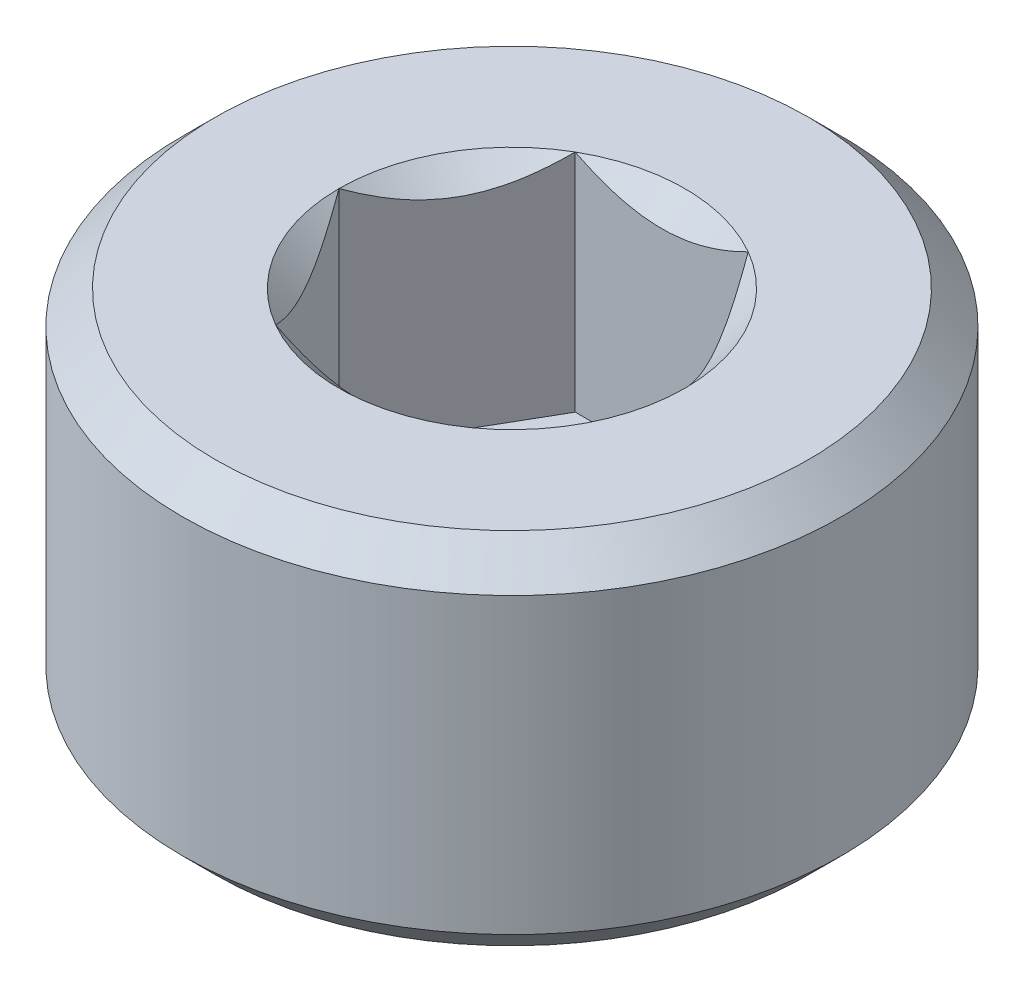
ISO-10303-21;
HEADER;
FILE_DESCRIPTION(('STEP AP214'),'2;1');
FILE_NAME('part.step','',(''),(''),'','','');
FILE_SCHEMA(('AUTOMOTIVE_DESIGN { 1 0 10303 214 1 1 1 1 }'));
ENDSEC;
DATA;
#1=APPLICATION_CONTEXT('core data for automotive mechanical design processes');
#2=APPLICATION_PROTOCOL_DEFINITION('international standard','automotive_design',2000,#1);
#3=PRODUCT_CONTEXT('',#1,'mechanical');
#4=PRODUCT('Part','Part','',(#3));
#5=PRODUCT_RELATED_PRODUCT_CATEGORY('part','',(#4));
#6=PRODUCT_DEFINITION_FORMATION('','',#4);
#7=PRODUCT_DEFINITION_CONTEXT('part definition',#1,'design');
#8=PRODUCT_DEFINITION('design','',#6,#7);
#9=PRODUCT_DEFINITION_SHAPE('','',#8);
#10=(LENGTH_UNIT() NAMED_UNIT(*) SI_UNIT(.MILLI.,.METRE.));
#11=(NAMED_UNIT(*) PLANE_ANGLE_UNIT() SI_UNIT($,.RADIAN.));
#12=(NAMED_UNIT(*) SI_UNIT($,.STERADIAN.) SOLID_ANGLE_UNIT());
#13=UNCERTAINTY_MEASURE_WITH_UNIT(LENGTH_MEASURE(1.E-05),#10,'distance_accuracy_value','');
#14=(GEOMETRIC_REPRESENTATION_CONTEXT(3) GLOBAL_UNCERTAINTY_ASSIGNED_CONTEXT((#13)) GLOBAL_UNIT_ASSIGNED_CONTEXT((#10,
#11,#12)) REPRESENTATION_CONTEXT('',''));
#15=CARTESIAN_POINT('',(0.,0.,0.));
#16=DIRECTION('',(0.,0.,1.));
#17=DIRECTION('',(1.,0.,0.));
#18=AXIS2_PLACEMENT_3D('',#15,#16,#17);
#19=CARTESIAN_POINT('',(0.,3.,0.));
#20=DIRECTION('',(0.,-1.,0.));
#21=DIRECTION('',(0.,0.,-1.));
#22=AXIS2_PLACEMENT_3D('',#19,#20,#21);
#23=CYLINDRICAL_SURFACE('',#22,2.75);
#24=CARTESIAN_POINT('',(0.,0.275000000000001,0.));
#25=DIRECTION('',(0.,1.,0.));
#26=DIRECTION('',(0.,0.,1.));
#27=AXIS2_PLACEMENT_3D('',#24,#25,#26);
#28=CIRCLE('',#27,2.75);
#29=CARTESIAN_POINT('',(0.,0.275000000000001,2.75));
#30=VERTEX_POINT('',#29);
#31=EDGE_CURVE('E216',#30,#30,#28,.T.);
#32=ORIENTED_EDGE('',*,*,#31,.T.);
#33=EDGE_LOOP('',(#32));
#34=FACE_BOUND('',#33,.T.);
#35=CARTESIAN_POINT('',(0.,2.725,0.));
#36=DIRECTION('',(0.,1.,0.));
#37=DIRECTION('',(0.,0.,1.));
#38=AXIS2_PLACEMENT_3D('',#35,#36,#37);
#39=CIRCLE('',#38,2.75);
#40=CARTESIAN_POINT('',(0.,2.725,2.75));
#41=VERTEX_POINT('',#40);
#42=EDGE_CURVE('E104',#41,#41,#39,.F.);
#43=ORIENTED_EDGE('',*,*,#42,.T.);
#44=EDGE_LOOP('',(#43));
#45=FACE_BOUND('',#44,.T.);
#46=ADVANCED_FACE('F33',(#34,#45),#23,.T.);
#47=CARTESIAN_POINT('',(0.,3.,0.));
#48=DIRECTION('',(0.,1.,0.));
#49=DIRECTION('',(0.,0.,1.));
#50=AXIS2_PLACEMENT_3D('',#47,#48,#49);
#51=PLANE('',#50);
#52=CARTESIAN_POINT('',(0.,3.,0.));
#53=DIRECTION('',(0.,1.,0.));
#54=DIRECTION('',(0.,0.,1.));
#55=AXIS2_PLACEMENT_3D('',#52,#53,#54);
#56=CIRCLE('',#55,2.475);
#57=CARTESIAN_POINT('',(0.,3.,2.475));
#58=VERTEX_POINT('',#57);
#59=EDGE_CURVE('E11',#58,#58,#56,.T.);
#60=ORIENTED_EDGE('',*,*,#59,.T.);
#61=EDGE_LOOP('',(#60));
#62=FACE_BOUND('',#61,.T.);
#63=CARTESIAN_POINT('',(0.,3.,0.));
#64=DIRECTION('',(0.,1.,0.));
#65=DIRECTION('',(0.,0.,1.));
#66=AXIS2_PLACEMENT_3D('',#63,#64,#65);
#67=CIRCLE('',#66,1.44337567297406);
#68=CARTESIAN_POINT('',(0.721687836487033,3.,1.25));
#69=VERTEX_POINT('',#68);
#70=CARTESIAN_POINT('',(1.44337567297406,3.,0.));
#71=VERTEX_POINT('',#70);
#72=EDGE_CURVE('E47',#69,#71,#67,.T.);
#73=ORIENTED_EDGE('',*,*,#72,.F.);
#74=CARTESIAN_POINT('',(-0.721687836487033,3.,1.25));
#75=VERTEX_POINT('',#74);
#76=EDGE_CURVE('E54',#75,#69,#67,.T.);
#77=ORIENTED_EDGE('',*,*,#76,.F.);
#78=CARTESIAN_POINT('',(-1.44337567297406,3.,0.));
#79=VERTEX_POINT('',#78);
#80=EDGE_CURVE('E127',#79,#75,#67,.T.);
#81=ORIENTED_EDGE('',*,*,#80,.F.);
#82=CARTESIAN_POINT('',(-0.721687836487033,3.,-1.25));
#83=VERTEX_POINT('',#82);
#84=EDGE_CURVE('E126',#83,#79,#67,.T.);
#85=ORIENTED_EDGE('',*,*,#84,.F.);
#86=CARTESIAN_POINT('',(0.721687836487032,3.,-1.25));
#87=VERTEX_POINT('',#86);
#88=EDGE_CURVE('E94',#87,#83,#67,.T.);
#89=ORIENTED_EDGE('',*,*,#88,.F.);
#90=EDGE_CURVE('E86',#71,#87,#67,.T.);
#91=ORIENTED_EDGE('',*,*,#90,.F.);
#92=EDGE_LOOP('',(#73,#77,#81,#85,#89,#91));
#93=FACE_BOUND('',#92,.T.);
#94=ADVANCED_FACE('F124',(#62,#93),#51,.T.);
#95=CARTESIAN_POINT('',(0.,0.,0.));
#96=DIRECTION('',(0.,1.,0.));
#97=DIRECTION('',(0.,0.,1.));
#98=AXIS2_PLACEMENT_3D('',#95,#96,#97);
#99=PLANE('',#98);
#100=CARTESIAN_POINT('',(0.,0.,0.));
#101=DIRECTION('',(0.,1.,0.));
#102=DIRECTION('',(0.,0.,1.));
#103=AXIS2_PLACEMENT_3D('',#100,#101,#102);
#104=CIRCLE('',#103,2.475);
#105=CARTESIAN_POINT('',(0.,0.,2.475));
#106=VERTEX_POINT('',#105);
#107=EDGE_CURVE('E41',#106,#106,#104,.F.);
#108=ORIENTED_EDGE('',*,*,#107,.T.);
#109=EDGE_LOOP('',(#108));
#110=FACE_BOUND('',#109,.T.);
#111=ADVANCED_FACE('F198',(#110),#99,.F.);
#112=CARTESIAN_POINT('',(0.,3.,0.));
#113=DIRECTION('',(0.,1.,0.));
#114=DIRECTION('',(0.,0.,1.));
#115=AXIS2_PLACEMENT_3D('',#112,#113,#114);
#116=CONICAL_SURFACE('',#115,1.44337567297406,0.78539816339745);
#117=ORIENTED_EDGE('',*,*,#88,.T.);
#118=CARTESIAN_POINT('',(-1.43934010808077,3.46298209689233,-1.25));
#119=CARTESIAN_POINT('',(-1.40429313005659,3.43652492263289,-1.25));
#120=CARTESIAN_POINT('',(-1.36905087135599,3.41032716035428,-1.25));
#121=CARTESIAN_POINT('',(-1.29809650706311,3.35855757183958,-1.25));
#122=CARTESIAN_POINT('',(-1.26238428576495,3.33298590435629,-1.25));
#123=CARTESIAN_POINT('',(-1.15390111792708,3.25700599368946,-1.25));
#124=CARTESIAN_POINT('',(-1.08031646726264,3.20774028618957,-1.25));
#125=CARTESIAN_POINT('',(-0.926012322755095,3.11102583026313,-1.25));
#126=CARTESIAN_POINT('',(-0.845125318656146,3.0638412989418,-1.25));
#127=CARTESIAN_POINT('',(-0.679311174076602,2.97753073439041,-1.25));
#128=CARTESIAN_POINT('',(-0.594398891026688,2.9383775346269,-1.25));
#129=CARTESIAN_POINT('',(-0.466944812460741,2.89047722368829,-1.25));
#130=CARTESIAN_POINT('',(-0.426289985812822,2.87672948978634,-1.25));
#131=CARTESIAN_POINT('',(-0.343998850091268,2.85249792745054,-1.25));
#132=CARTESIAN_POINT('',(-0.302362473614962,2.84201432386977,-1.25));
#133=CARTESIAN_POINT('',(-0.219052696285666,2.8250301617483,-1.25));
#134=CARTESIAN_POINT('',(-0.1773934284745,2.81846136047137,-1.25));
#135=CARTESIAN_POINT('',(-0.0936293693401924,2.80943505345776,-1.25));
#136=CARTESIAN_POINT('',(-0.0515246558543963,2.80697684099727,-1.25));
#137=CARTESIAN_POINT('',(0.0311890576306314,2.80635406201328,-1.25));
#138=CARTESIAN_POINT('',(0.0717969625499302,2.80803711684625,-1.25));
#139=CARTESIAN_POINT('',(0.152668636885197,2.81526827059791,-1.25));
#140=CARTESIAN_POINT('',(0.192932338835358,2.82081711041311,-1.25));
#141=CARTESIAN_POINT('',(0.273499879165295,2.83557103646495,-1.25));
#142=CARTESIAN_POINT('',(0.313792180618511,2.8448381759641,-1.25));
#143=CARTESIAN_POINT('',(0.393496413911457,2.86653617845735,-1.25));
#144=CARTESIAN_POINT('',(0.432908419115059,2.87896677673064,-1.25));
#145=CARTESIAN_POINT('',(0.556992735862298,2.92277935293144,-1.25));
#146=CARTESIAN_POINT('',(0.639898924666085,2.95915107287596,-1.25));
#147=CARTESIAN_POINT('',(0.801816555499701,3.04001916217833,-1.25));
#148=CARTESIAN_POINT('',(0.880812666325045,3.08454472091199,-1.25));
#149=CARTESIAN_POINT('',(1.0317856127975,3.17640487666662,-1.25));
#150=CARTESIAN_POINT('',(1.10391618485086,3.22348993391625,-1.25));
#151=CARTESIAN_POINT('',(1.21018606043311,3.29627856159854,-1.25));
#152=CARTESIAN_POINT('',(1.24515069969379,3.32079808539336,-1.25));
#153=CARTESIAN_POINT('',(1.31460220852736,3.37048563676568,-1.25));
#154=CARTESIAN_POINT('',(1.34908920596618,3.39565348541552,-1.25));
#155=CARTESIAN_POINT('',(1.38337731682912,3.42109014884121,-1.25));
#156=B_SPLINE_CURVE_WITH_KNOTS('',3,(#118,#119,#120,#121,#122,#123,#124,#125,#126,#127,#128,
#129,#130,#131,#132,#133,#134,#135,#136,#137,#138,#139,#140,#141,#142,#143,#144,#145,#146,#147,
#148,#149,#150,#151,#152,#153,#154,#155),.UNSPECIFIED.,.F.,.F.,(4,2,2,2,2,2,2,2,2,2,2,2,2,2,2,2,
2,2,4),(0.,0.131732960381448,0.263498984161645,0.529042014455825,0.809741926134617,
1.08947609717225,1.21811634272576,1.346765447839,1.47310084517844,1.59941451973784,
1.72115042167849,1.84290966131735,1.96679153905341,2.09066305366039,2.36146692896009,
2.63325989198491,2.89154668212279,3.01965734507713,3.14773302245628),.UNSPECIFIED.);
#157=EDGE_CURVE('E99',#87,#83,#156,.F.);
#158=ORIENTED_EDGE('',*,*,#157,.F.);
#159=EDGE_LOOP('',(#117,#158));
#160=FACE_BOUND('',#159,.T.);
#161=ADVANCED_FACE('F100',(#160),#116,.F.);
#162=ORIENTED_EDGE('',*,*,#84,.T.);
#163=CARTESIAN_POINT('',(-0.721572366433195,3.00011548390914,-1.2502));
#164=CARTESIAN_POINT('',(-0.746384090710444,2.9753216680551,-1.20722483292841));
#165=CARTESIAN_POINT('',(-0.771610739653664,2.95198373441868,-1.16353099525405));
#166=CARTESIAN_POINT('',(-0.823050873919155,2.90925200408454,-1.07443406915806));
#167=CARTESIAN_POINT('',(-0.849269254648333,2.88988199236041,-1.02902250164294));
#168=CARTESIAN_POINT('',(-0.902137405038635,2.85670048341348,-0.937452179064741));
#169=CARTESIAN_POINT('',(-0.928773701756387,2.84280555905266,-0.891316759824115));
#170=CARTESIAN_POINT('',(-0.982632884076012,2.82139728216064,-0.798029919592408));
#171=CARTESIAN_POINT('',(-1.00985412292348,2.81386794156679,-0.750881350863621));
#172=CARTESIAN_POINT('',(-1.05676666578643,2.8070744980507,-0.669626443112748));
#173=CARTESIAN_POINT('',(-1.07639733689152,2.80606855910435,-0.63562512337206));
#174=CARTESIAN_POINT('',(-1.11562418145499,2.80776141491132,-0.567682235567523));
#175=CARTESIAN_POINT('',(-1.1352203463451,2.81046102721554,-0.533740682344343));
#176=CARTESIAN_POINT('',(-1.1742235548576,2.81940893031638,-0.466185143542501));
#177=CARTESIAN_POINT('',(-1.19363040521233,2.82566052589971,-0.432571492713226));
#178=CARTESIAN_POINT('',(-1.23212011385119,2.8413756814139,-0.365905361782188));
#179=CARTESIAN_POINT('',(-1.2512028293628,2.85084062008746,-0.332853128969705));
#180=CARTESIAN_POINT('',(-1.30007715810653,2.87893139068759,-0.248200308399736));
#181=CARTESIAN_POINT('',(-1.32956058931202,2.8996701574522,-0.197133507570362));
#182=CARTESIAN_POINT('',(-1.38737318998519,2.94638713467148,-0.0969991458867452));
#183=CARTESIAN_POINT('',(-1.41570576386268,2.97234829594677,-0.0479256884217304));
#184=CARTESIAN_POINT('',(-1.4434911430279,3.00011548390914,0.000200000000000358));
#185=B_SPLINE_CURVE_WITH_KNOTS('',3,(#163,#164,#165,#166,#167,#168,#169,#170,#171,#172,#173,
#174,#175,#176,#177,#178,#179,#180,#181,#182,#183,#184),.UNSPECIFIED.,.F.,.F.,(4,2,2,2,2,2,2,2,
2,2,4),(0.,0.166533409618303,0.334037607289761,0.498880396489697,0.663307919240274,
0.780963963458826,0.898645970148452,1.01643764860773,1.13427993171549,1.32148652032141,
1.50809158792574),.UNSPECIFIED.);
#186=EDGE_CURVE('E129',#83,#79,#185,.T.);
#187=ORIENTED_EDGE('',*,*,#186,.F.);
#188=EDGE_LOOP('',(#162,#187));
#189=FACE_BOUND('',#188,.T.);
#190=ADVANCED_FACE('F227',(#189),#116,.F.);
#191=ORIENTED_EDGE('',*,*,#80,.T.);
#192=CARTESIAN_POINT('',(-1.4434911430279,3.00011548390914,-0.000199999999999785));
#193=CARTESIAN_POINT('',(-1.41867941875065,2.9753216680551,0.0427751670715869));
#194=CARTESIAN_POINT('',(-1.39345276980743,2.95198373441868,0.0864690047459481));
#195=CARTESIAN_POINT('',(-1.34201263554194,2.90925200408454,0.175565930841942));
#196=CARTESIAN_POINT('',(-1.31579425481276,2.88988199236041,0.220977498357064));
#197=CARTESIAN_POINT('',(-1.26292610442246,2.85670048341348,0.31254782093526));
#198=CARTESIAN_POINT('',(-1.23628980770471,2.84280555905266,0.358683240175886));
#199=CARTESIAN_POINT('',(-1.18243062538508,2.82139728216064,0.451970080407593));
#200=CARTESIAN_POINT('',(-1.15520938653761,2.81386794156679,0.49911864913638));
#201=CARTESIAN_POINT('',(-1.10829684367467,2.8070744980507,0.580373556887253));
#202=CARTESIAN_POINT('',(-1.08866617256958,2.80606855910435,0.614374876627941));
#203=CARTESIAN_POINT('',(-1.04943932800611,2.80776141491132,0.682317764432478));
#204=CARTESIAN_POINT('',(-1.02984316311599,2.81046102721554,0.716259317655658));
#205=CARTESIAN_POINT('',(-0.990839954603499,2.81940893031638,0.7838148564575));
#206=CARTESIAN_POINT('',(-0.971433104248771,2.82566052589971,0.817428507286775));
#207=CARTESIAN_POINT('',(-0.932943395609905,2.8413756814139,0.884094638217813));
#208=CARTESIAN_POINT('',(-0.9138606800983,2.85084062008746,0.917146871030296));
#209=CARTESIAN_POINT('',(-0.864986351354568,2.87893139068759,1.00179969160026));
#210=CARTESIAN_POINT('',(-0.835502920149076,2.8996701574522,1.05286649242964));
#211=CARTESIAN_POINT('',(-0.777690319475909,2.94638713467148,1.15300085411325));
#212=CARTESIAN_POINT('',(-0.749357745598417,2.97234829594677,1.20207431157827));
#213=CARTESIAN_POINT('',(-0.721572366433195,3.00011548390914,1.2502));
#214=B_SPLINE_CURVE_WITH_KNOTS('',3,(#192,#193,#194,#195,#196,#197,#198,#199,#200,#201,#202,
#203,#204,#205,#206,#207,#208,#209,#210,#211,#212,#213),.UNSPECIFIED.,.F.,.F.,(4,2,2,2,2,2,2,2,
2,2,4),(0.,0.166533409618303,0.334037607289761,0.498880396489698,0.663307919240275,
0.780963963458827,0.898645970148453,1.01643764860773,1.1342799317155,1.32148652032141,
1.50809158792573),.UNSPECIFIED.);
#215=EDGE_CURVE('E137',#79,#75,#214,.T.);
#216=ORIENTED_EDGE('',*,*,#215,.F.);
#217=EDGE_LOOP('',(#191,#216));
#218=FACE_BOUND('',#217,.T.);
#219=ADVANCED_FACE('F231',(#218),#116,.F.);
#220=ORIENTED_EDGE('',*,*,#76,.T.);
#221=CARTESIAN_POINT('',(-1.43934010808077,3.46298209689233,1.25));
#222=CARTESIAN_POINT('',(-1.40429313005659,3.43652492263289,1.25));
#223=CARTESIAN_POINT('',(-1.36905087135599,3.41032716035428,1.25));
#224=CARTESIAN_POINT('',(-1.29809650706311,3.35855757183958,1.25));
#225=CARTESIAN_POINT('',(-1.26238428576495,3.33298590435629,1.25));
#226=CARTESIAN_POINT('',(-1.15390111792708,3.25700599368946,1.25));
#227=CARTESIAN_POINT('',(-1.08031646726264,3.20774028618957,1.25));
#228=CARTESIAN_POINT('',(-0.926012322755096,3.11102583026313,1.25));
#229=CARTESIAN_POINT('',(-0.845125318656147,3.0638412989418,1.25));
#230=CARTESIAN_POINT('',(-0.679311174076603,2.97753073439041,1.25));
#231=CARTESIAN_POINT('',(-0.594398891026688,2.9383775346269,1.25));
#232=CARTESIAN_POINT('',(-0.46694481246074,2.89047722368829,1.25));
#233=CARTESIAN_POINT('',(-0.426289985812822,2.87672948978634,1.25));
#234=CARTESIAN_POINT('',(-0.343998850091268,2.85249792745054,1.25));
#235=CARTESIAN_POINT('',(-0.302362473614962,2.84201432386977,1.25));
#236=CARTESIAN_POINT('',(-0.219052696285665,2.8250301617483,1.25));
#237=CARTESIAN_POINT('',(-0.1773934284745,2.81846136047137,1.25));
#238=CARTESIAN_POINT('',(-0.0936293693401921,2.80943505345776,1.25));
#239=CARTESIAN_POINT('',(-0.051524655854396,2.80697684099727,1.25));
#240=CARTESIAN_POINT('',(0.0311890576306315,2.80635406201328,1.25));
#241=CARTESIAN_POINT('',(0.0717969625499303,2.80803711684625,1.25));
#242=CARTESIAN_POINT('',(0.152668636885197,2.81526827059791,1.25));
#243=CARTESIAN_POINT('',(0.192932338835358,2.82081711041311,1.25));
#244=CARTESIAN_POINT('',(0.273499879165295,2.83557103646495,1.25));
#245=CARTESIAN_POINT('',(0.313792180618511,2.8448381759641,1.25));
#246=CARTESIAN_POINT('',(0.393496413911457,2.86653617845735,1.25));
#247=CARTESIAN_POINT('',(0.432908419115059,2.87896677673064,1.25));
#248=CARTESIAN_POINT('',(0.556992735862298,2.92277935293144,1.25));
#249=CARTESIAN_POINT('',(0.639898924666085,2.95915107287595,1.25));
#250=CARTESIAN_POINT('',(0.801816555499701,3.04001916217833,1.25));
#251=CARTESIAN_POINT('',(0.880812666325044,3.08454472091198,1.25));
#252=CARTESIAN_POINT('',(1.0317856127975,3.17640487666662,1.25));
#253=CARTESIAN_POINT('',(1.10391618485086,3.22348993391625,1.25));
#254=CARTESIAN_POINT('',(1.2101860604331,3.29627856159854,1.25));
#255=CARTESIAN_POINT('',(1.24515069969379,3.32079808539336,1.25));
#256=CARTESIAN_POINT('',(1.31460220852736,3.37048563676568,1.25));
#257=CARTESIAN_POINT('',(1.34908920596618,3.39565348541552,1.25));
#258=CARTESIAN_POINT('',(1.38337731682911,3.42109014884121,1.25));
#259=B_SPLINE_CURVE_WITH_KNOTS('',3,(#221,#222,#223,#224,#225,#226,#227,#228,#229,#230,#231,
#232,#233,#234,#235,#236,#237,#238,#239,#240,#241,#242,#243,#244,#245,#246,#247,#248,#249,#250,
#251,#252,#253,#254,#255,#256,#257,#258),.UNSPECIFIED.,.F.,.F.,(4,2,2,2,2,2,2,2,2,2,2,2,2,2,2,2,
2,2,4),(0.,0.131732960381448,0.263498984161645,0.529042014455826,0.809741926134619,
1.08947609717225,1.21811634272577,1.34676544783901,1.47310084517844,1.59941451973785,
1.7211504216785,1.84290966131735,1.96679153905342,2.09066305366039,2.36146692896009,
2.63325989198491,2.89154668212279,3.01965734507713,3.14773302245628),.UNSPECIFIED.);
#260=EDGE_CURVE('E161',#75,#69,#259,.T.);
#261=ORIENTED_EDGE('',*,*,#260,.F.);
#262=EDGE_LOOP('',(#220,#261));
#263=FACE_BOUND('',#262,.T.);
#264=ADVANCED_FACE('F236',(#263),#116,.F.);
#265=ORIENTED_EDGE('',*,*,#72,.T.);
#266=CARTESIAN_POINT('',(0.721572366433194,3.00011548390914,1.2502));
#267=CARTESIAN_POINT('',(0.746384090710444,2.9753216680551,1.20722483292841));
#268=CARTESIAN_POINT('',(0.771610739653664,2.95198373441868,1.16353099525405));
#269=CARTESIAN_POINT('',(0.823050873919154,2.90925200408454,1.07443406915806));
#270=CARTESIAN_POINT('',(0.849269254648333,2.88988199236041,1.02902250164294));
#271=CARTESIAN_POINT('',(0.902137405038635,2.85670048341348,0.93745217906474));
#272=CARTESIAN_POINT('',(0.928773701756386,2.84280555905266,0.891316759824115));
#273=CARTESIAN_POINT('',(0.982632884076012,2.82139728216064,0.798029919592408));
#274=CARTESIAN_POINT('',(1.00985412292348,2.81386794156679,0.750881350863621));
#275=CARTESIAN_POINT('',(1.05676666578643,2.8070744980507,0.669626443112748));
#276=CARTESIAN_POINT('',(1.07639733689152,2.80606855910435,0.63562512337206));
#277=CARTESIAN_POINT('',(1.11562418145499,2.80776141491132,0.567682235567523));
#278=CARTESIAN_POINT('',(1.1352203463451,2.81046102721554,0.533740682344343));
#279=CARTESIAN_POINT('',(1.1742235548576,2.81940893031638,0.466185143542501));
#280=CARTESIAN_POINT('',(1.19363040521232,2.8256605258997,0.432571492713226));
#281=CARTESIAN_POINT('',(1.23212011385119,2.8413756814139,0.365905361782188));
#282=CARTESIAN_POINT('',(1.2512028293628,2.85084062008746,0.332853128969705));
#283=CARTESIAN_POINT('',(1.30007715810653,2.87893139068759,0.248200308399736));
#284=CARTESIAN_POINT('',(1.32956058931202,2.8996701574522,0.197133507570362));
#285=CARTESIAN_POINT('',(1.38737318998519,2.94638713467148,0.096999145886745));
#286=CARTESIAN_POINT('',(1.41570576386268,2.97234829594677,0.04792568842173));
#287=CARTESIAN_POINT('',(1.4434911430279,3.00011548390914,-0.000200000000000782));
#288=B_SPLINE_CURVE_WITH_KNOTS('',3,(#266,#267,#268,#269,#270,#271,#272,#273,#274,#275,#276,
#277,#278,#279,#280,#281,#282,#283,#284,#285,#286,#287),.UNSPECIFIED.,.F.,.F.,(4,2,2,2,2,2,2,2,
2,2,4),(0.,0.166533409618303,0.334037607289761,0.498880396489697,0.663307919240274,
0.780963963458826,0.898645970148452,1.01643764860773,1.13427993171549,1.32148652032141,
1.50809158792574),.UNSPECIFIED.);
#289=EDGE_CURVE('E114',#69,#71,#288,.T.);
#290=ORIENTED_EDGE('',*,*,#289,.F.);
#291=EDGE_LOOP('',(#265,#290));
#292=FACE_BOUND('',#291,.T.);
#293=ADVANCED_FACE('F150',(#292),#116,.F.);
#294=ORIENTED_EDGE('',*,*,#90,.T.);
#295=CARTESIAN_POINT('',(1.4434911430279,3.00011548390914,0.000199999999999333));
#296=CARTESIAN_POINT('',(1.41867941875065,2.9753216680551,-0.0427751670715874));
#297=CARTESIAN_POINT('',(1.39345276980743,2.95198373441868,-0.0864690047459486));
#298=CARTESIAN_POINT('',(1.34201263554194,2.90925200408454,-0.175565930841942));
#299=CARTESIAN_POINT('',(1.31579425481276,2.88988199236041,-0.220977498357064));
#300=CARTESIAN_POINT('',(1.26292610442246,2.85670048341348,-0.31254782093526));
#301=CARTESIAN_POINT('',(1.23628980770471,2.84280555905266,-0.358683240175886));
#302=CARTESIAN_POINT('',(1.18243062538508,2.82139728216064,-0.451970080407593));
#303=CARTESIAN_POINT('',(1.15520938653761,2.81386794156679,-0.49911864913638));
#304=CARTESIAN_POINT('',(1.10829684367467,2.8070744980507,-0.580373556887252));
#305=CARTESIAN_POINT('',(1.08866617256958,2.80606855910435,-0.614374876627941));
#306=CARTESIAN_POINT('',(1.04943932800611,2.80776141491132,-0.682317764432477));
#307=CARTESIAN_POINT('',(1.02984316311599,2.81046102721554,-0.716259317655657));
#308=CARTESIAN_POINT('',(0.990839954603499,2.81940893031638,-0.783814856457499));
#309=CARTESIAN_POINT('',(0.971433104248771,2.82566052589971,-0.817428507286775));
#310=CARTESIAN_POINT('',(0.932943395609905,2.8413756814139,-0.884094638217813));
#311=CARTESIAN_POINT('',(0.9138606800983,2.85084062008746,-0.917146871030295));
#312=CARTESIAN_POINT('',(0.864986351354567,2.87893139068759,-1.00179969160026));
#313=CARTESIAN_POINT('',(0.835502920149075,2.8996701574522,-1.05286649242964));
#314=CARTESIAN_POINT('',(0.777690319475908,2.94638713467148,-1.15300085411326));
#315=CARTESIAN_POINT('',(0.749357745598416,2.97234829594677,-1.20207431157827));
#316=CARTESIAN_POINT('',(0.721572366433194,3.00011548390914,-1.2502));
#317=B_SPLINE_CURVE_WITH_KNOTS('',3,(#295,#296,#297,#298,#299,#300,#301,#302,#303,#304,#305,
#306,#307,#308,#309,#310,#311,#312,#313,#314,#315,#316),.UNSPECIFIED.,.F.,.F.,(4,2,2,2,2,2,2,2,
2,2,4),(0.,0.166533409618303,0.334037607289761,0.498880396489698,0.663307919240274,
0.780963963458826,0.898645970148452,1.01643764860773,1.13427993171549,1.32148652032141,
1.50809158792574),.UNSPECIFIED.);
#318=EDGE_CURVE('E90',#71,#87,#317,.T.);
#319=ORIENTED_EDGE('',*,*,#318,.F.);
#320=EDGE_LOOP('',(#294,#319));
#321=FACE_BOUND('',#320,.T.);
#322=ADVANCED_FACE('F88',(#321),#116,.F.);
#323=CARTESIAN_POINT('',(0.,1.12,0.));
#324=DIRECTION('',(0.,1.,0.));
#325=DIRECTION('',(0.,0.,1.));
#326=AXIS2_PLACEMENT_3D('',#323,#324,#325);
#327=PLANE('',#326);
#328=DIRECTION('',(-0.5,0.,-0.866025403784438));
#329=VECTOR('',#328,1.);
#330=CARTESIAN_POINT('',(1.44337567297406,1.12,0.));
#331=LINE('',#330,#329);
#332=CARTESIAN_POINT('',(1.44337567297406,1.12,0.));
#333=VERTEX_POINT('',#332);
#334=CARTESIAN_POINT('',(0.721687836487032,1.12,-1.25));
#335=VERTEX_POINT('',#334);
#336=EDGE_CURVE('E113',#333,#335,#331,.T.);
#337=ORIENTED_EDGE('',*,*,#336,.T.);
#338=DIRECTION('',(-1.,0.,0.));
#339=VECTOR('',#338,1.);
#340=CARTESIAN_POINT('',(0.721687836487032,1.12,-1.25));
#341=LINE('',#340,#339);
#342=CARTESIAN_POINT('',(-0.721687836487032,1.12,-1.25));
#343=VERTEX_POINT('',#342);
#344=EDGE_CURVE('E118',#335,#343,#341,.T.);
#345=ORIENTED_EDGE('',*,*,#344,.T.);
#346=DIRECTION('',(-0.5,0.,0.866025403784439));
#347=VECTOR('',#346,1.);
#348=CARTESIAN_POINT('',(-0.721687836487032,1.12,-1.25));
#349=LINE('',#348,#347);
#350=CARTESIAN_POINT('',(-1.44337567297406,1.12,0.));
#351=VERTEX_POINT('',#350);
#352=EDGE_CURVE('E262',#343,#351,#349,.T.);
#353=ORIENTED_EDGE('',*,*,#352,.T.);
#354=DIRECTION('',(0.5,0.,0.866025403784439));
#355=VECTOR('',#354,1.);
#356=CARTESIAN_POINT('',(-1.44337567297406,1.12,0.));
#357=LINE('',#356,#355);
#358=CARTESIAN_POINT('',(-0.721687836487033,1.12,1.25));
#359=VERTEX_POINT('',#358);
#360=EDGE_CURVE('E245',#351,#359,#357,.T.);
#361=ORIENTED_EDGE('',*,*,#360,.T.);
#362=DIRECTION('',(1.,0.,0.));
#363=VECTOR('',#362,1.);
#364=CARTESIAN_POINT('',(-0.721687836487033,1.12,1.25));
#365=LINE('',#364,#363);
#366=CARTESIAN_POINT('',(0.721687836487032,1.12,1.25));
#367=VERTEX_POINT('',#366);
#368=EDGE_CURVE('E258',#359,#367,#365,.T.);
#369=ORIENTED_EDGE('',*,*,#368,.T.);
#370=DIRECTION('',(0.5,0.,-0.866025403784439));
#371=VECTOR('',#370,1.);
#372=CARTESIAN_POINT('',(0.721687836487032,1.12,1.25));
#373=LINE('',#372,#371);
#374=EDGE_CURVE('E121',#367,#333,#373,.T.);
#375=ORIENTED_EDGE('',*,*,#374,.T.);
#376=EDGE_LOOP('',(#337,#345,#353,#361,#369,#375));
#377=FACE_BOUND('',#376,.T.);
#378=ADVANCED_FACE('F149',(#377),#327,.T.);
#379=CARTESIAN_POINT('',(0.721687836487032,1.12,-1.25));
#380=DIRECTION('',(0.,0.,-1.));
#381=DIRECTION('',(-1.,0.,0.));
#382=AXIS2_PLACEMENT_3D('',#379,#380,#381);
#383=PLANE('',#382);
#384=DIRECTION('',(0.,1.,0.));
#385=VECTOR('',#384,1.);
#386=CARTESIAN_POINT('',(0.721687836487032,1.12,-1.25));
#387=LINE('',#386,#385);
#388=EDGE_CURVE('E111',#335,#87,#387,.T.);
#389=ORIENTED_EDGE('',*,*,#388,.T.);
#390=ORIENTED_EDGE('',*,*,#157,.T.);
#391=DIRECTION('',(0.,1.,0.));
#392=VECTOR('',#391,1.);
#393=CARTESIAN_POINT('',(-0.721687836487032,1.12,-1.25));
#394=LINE('',#393,#392);
#395=EDGE_CURVE('E120',#343,#83,#394,.T.);
#396=ORIENTED_EDGE('',*,*,#395,.F.);
#397=ORIENTED_EDGE('',*,*,#344,.F.);
#398=EDGE_LOOP('',(#389,#390,#396,#397));
#399=FACE_BOUND('',#398,.T.);
#400=ADVANCED_FACE('F116',(#399),#383,.F.);
#401=CARTESIAN_POINT('',(-0.721687836487032,1.12,-1.25));
#402=DIRECTION('',(-0.866025403784439,0.,-0.5));
#403=DIRECTION('',(-0.5,0.,0.866025403784439));
#404=AXIS2_PLACEMENT_3D('',#401,#402,#403);
#405=PLANE('',#404);
#406=ORIENTED_EDGE('',*,*,#395,.T.);
#407=ORIENTED_EDGE('',*,*,#186,.T.);
#408=DIRECTION('',(0.,1.,0.));
#409=VECTOR('',#408,1.);
#410=CARTESIAN_POINT('',(-1.44337567297406,1.12,0.));
#411=LINE('',#410,#409);
#412=EDGE_CURVE('E242',#351,#79,#411,.T.);
#413=ORIENTED_EDGE('',*,*,#412,.F.);
#414=ORIENTED_EDGE('',*,*,#352,.F.);
#415=EDGE_LOOP('',(#406,#407,#413,#414));
#416=FACE_BOUND('',#415,.T.);
#417=ADVANCED_FACE('F143',(#416),#405,.F.);
#418=CARTESIAN_POINT('',(-1.44337567297406,1.12,0.));
#419=DIRECTION('',(-0.866025403784439,0.,0.5));
#420=DIRECTION('',(0.5,0.,0.866025403784439));
#421=AXIS2_PLACEMENT_3D('',#418,#419,#420);
#422=PLANE('',#421);
#423=ORIENTED_EDGE('',*,*,#412,.T.);
#424=ORIENTED_EDGE('',*,*,#215,.T.);
#425=DIRECTION('',(0.,1.,0.));
#426=VECTOR('',#425,1.);
#427=CARTESIAN_POINT('',(-0.721687836487033,1.12,1.25));
#428=LINE('',#427,#426);
#429=EDGE_CURVE('E247',#359,#75,#428,.T.);
#430=ORIENTED_EDGE('',*,*,#429,.F.);
#431=ORIENTED_EDGE('',*,*,#360,.F.);
#432=EDGE_LOOP('',(#423,#424,#430,#431));
#433=FACE_BOUND('',#432,.T.);
#434=ADVANCED_FACE('F182',(#433),#422,.F.);
#435=CARTESIAN_POINT('',(-0.721687836487033,1.12,1.25));
#436=DIRECTION('',(0.,0.,1.));
#437=DIRECTION('',(1.,0.,0.));
#438=AXIS2_PLACEMENT_3D('',#435,#436,#437);
#439=PLANE('',#438);
#440=ORIENTED_EDGE('',*,*,#429,.T.);
#441=ORIENTED_EDGE('',*,*,#260,.T.);
#442=DIRECTION('',(0.,1.,0.));
#443=VECTOR('',#442,1.);
#444=CARTESIAN_POINT('',(0.721687836487032,1.12,1.25));
#445=LINE('',#444,#443);
#446=EDGE_CURVE('E249',#367,#69,#445,.T.);
#447=ORIENTED_EDGE('',*,*,#446,.F.);
#448=ORIENTED_EDGE('',*,*,#368,.F.);
#449=EDGE_LOOP('',(#440,#441,#447,#448));
#450=FACE_BOUND('',#449,.T.);
#451=ADVANCED_FACE('F178',(#450),#439,.F.);
#452=CARTESIAN_POINT('',(0.721687836487032,1.12,1.25));
#453=DIRECTION('',(0.866025403784439,0.,0.5));
#454=DIRECTION('',(0.5,0.,-0.866025403784439));
#455=AXIS2_PLACEMENT_3D('',#452,#453,#454);
#456=PLANE('',#455);
#457=ORIENTED_EDGE('',*,*,#446,.T.);
#458=ORIENTED_EDGE('',*,*,#289,.T.);
#459=DIRECTION('',(0.,1.,0.));
#460=VECTOR('',#459,1.);
#461=CARTESIAN_POINT('',(1.44337567297406,1.12,0.));
#462=LINE('',#461,#460);
#463=EDGE_CURVE('E105',#333,#71,#462,.T.);
#464=ORIENTED_EDGE('',*,*,#463,.F.);
#465=ORIENTED_EDGE('',*,*,#374,.F.);
#466=EDGE_LOOP('',(#457,#458,#464,#465));
#467=FACE_BOUND('',#466,.T.);
#468=ADVANCED_FACE('F175',(#467),#456,.F.);
#469=CARTESIAN_POINT('',(1.44337567297406,1.12,0.));
#470=DIRECTION('',(0.866025403784438,0.,-0.5));
#471=DIRECTION('',(-0.5,0.,-0.866025403784439));
#472=AXIS2_PLACEMENT_3D('',#469,#470,#471);
#473=PLANE('',#472);
#474=ORIENTED_EDGE('',*,*,#463,.T.);
#475=ORIENTED_EDGE('',*,*,#318,.T.);
#476=ORIENTED_EDGE('',*,*,#388,.F.);
#477=ORIENTED_EDGE('',*,*,#336,.F.);
#478=EDGE_LOOP('',(#474,#475,#476,#477));
#479=FACE_BOUND('',#478,.T.);
#480=ADVANCED_FACE('F109',(#479),#473,.F.);
#481=CARTESIAN_POINT('',(0.,0.275000000000001,0.));
#482=DIRECTION('',(0.,1.,0.));
#483=DIRECTION('',(0.,0.,1.));
#484=AXIS2_PLACEMENT_3D('',#481,#482,#483);
#485=CONICAL_SURFACE('',#484,2.75,0.785398163397451);
#486=ORIENTED_EDGE('',*,*,#107,.F.);
#487=EDGE_LOOP('',(#486));
#488=FACE_BOUND('',#487,.T.);
#489=ORIENTED_EDGE('',*,*,#31,.F.);
#490=EDGE_LOOP('',(#489));
#491=FACE_BOUND('',#490,.T.);
#492=ADVANCED_FACE('F204',(#488,#491),#485,.T.);
#493=CARTESIAN_POINT('',(0.,3.,0.));
#494=DIRECTION('',(0.,-1.,0.));
#495=DIRECTION('',(0.,0.,-1.));
#496=AXIS2_PLACEMENT_3D('',#493,#494,#495);
#497=CONICAL_SURFACE('',#496,2.475,0.785398163397447);
#498=ORIENTED_EDGE('',*,*,#42,.F.);
#499=EDGE_LOOP('',(#498));
#500=FACE_BOUND('',#499,.T.);
#501=ORIENTED_EDGE('',*,*,#59,.F.);
#502=EDGE_LOOP('',(#501));
#503=FACE_BOUND('',#502,.T.);
#504=ADVANCED_FACE('F35',(#500,#503),#497,.T.);
#505=CLOSED_SHELL('',(#46,#94,#111,#161,#190,#219,#264,#293,#322,#378,#400,#417,#434,#451,#468,
#480,#492,#504));
#506=MANIFOLD_SOLID_BREP('B2',#505);
#507=ADVANCED_BREP_SHAPE_REPRESENTATION('',(#18,#506),#14);
#508=SHAPE_DEFINITION_REPRESENTATION(#9,#507);
ENDSEC;
END-ISO-10303-21;
